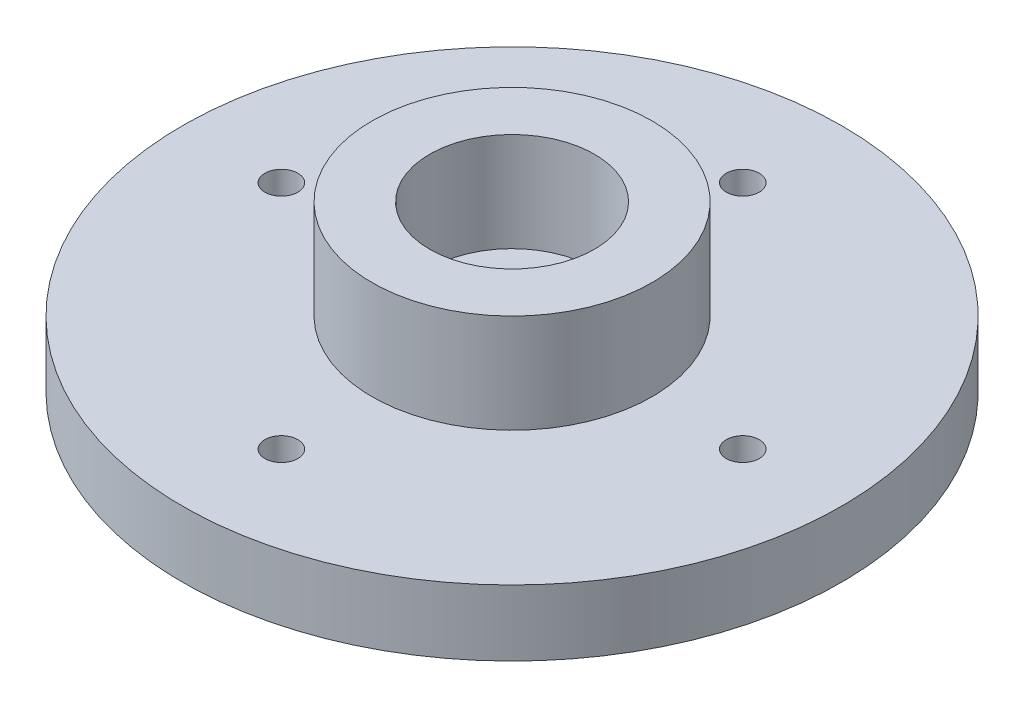
ISO-10303-21;
HEADER;
FILE_DESCRIPTION(('STEP AP214'),'2;1');
FILE_NAME('part.step','',(''),(''),'','','');
FILE_SCHEMA(('AUTOMOTIVE_DESIGN { 1 0 10303 214 1 1 1 1 }'));
ENDSEC;
DATA;
#1=APPLICATION_CONTEXT('core data for automotive mechanical design processes');
#2=APPLICATION_PROTOCOL_DEFINITION('international standard','automotive_design',2000,#1);
#3=PRODUCT_CONTEXT('',#1,'mechanical');
#4=PRODUCT('Part','Part','',(#3));
#5=PRODUCT_RELATED_PRODUCT_CATEGORY('part','',(#4));
#6=PRODUCT_DEFINITION_FORMATION('','',#4);
#7=PRODUCT_DEFINITION_CONTEXT('part definition',#1,'design');
#8=PRODUCT_DEFINITION('design','',#6,#7);
#9=PRODUCT_DEFINITION_SHAPE('','',#8);
#10=(LENGTH_UNIT() NAMED_UNIT(*) SI_UNIT(.MILLI.,.METRE.));
#11=(NAMED_UNIT(*) PLANE_ANGLE_UNIT() SI_UNIT($,.RADIAN.));
#12=(NAMED_UNIT(*) SI_UNIT($,.STERADIAN.) SOLID_ANGLE_UNIT());
#13=UNCERTAINTY_MEASURE_WITH_UNIT(LENGTH_MEASURE(1.E-05),#10,'distance_accuracy_value','');
#14=(GEOMETRIC_REPRESENTATION_CONTEXT(3) GLOBAL_UNCERTAINTY_ASSIGNED_CONTEXT((#13)) GLOBAL_UNIT_ASSIGNED_CONTEXT((#10,
#11,#12)) REPRESENTATION_CONTEXT('',''));
#15=CARTESIAN_POINT('',(0.,0.,0.));
#16=DIRECTION('',(0.,0.,1.));
#17=DIRECTION('',(1.,0.,0.));
#18=AXIS2_PLACEMENT_3D('',#15,#16,#17);
#19=CARTESIAN_POINT('',(0.,2.,0.));
#20=DIRECTION('',(0.,1.,0.));
#21=DIRECTION('',(0.,0.,1.));
#22=AXIS2_PLACEMENT_3D('',#19,#20,#21);
#23=PLANE('',#22);
#24=CARTESIAN_POINT('',(0.,2.,0.));
#25=DIRECTION('',(0.,1.,0.));
#26=DIRECTION('',(0.,0.,1.));
#27=AXIS2_PLACEMENT_3D('',#24,#25,#26);
#28=CIRCLE('',#27,2.5);
#29=CARTESIAN_POINT('',(0.,2.,2.5));
#30=VERTEX_POINT('',#29);
#31=EDGE_CURVE('E25',#30,#30,#28,.T.);
#32=ORIENTED_EDGE('',*,*,#31,.T.);
#33=EDGE_LOOP('',(#32));
#34=FACE_BOUND('',#33,.T.);
#35=CARTESIAN_POINT('',(0.,2.,0.));
#36=DIRECTION('',(0.,1.,0.));
#37=DIRECTION('',(0.,0.,1.));
#38=AXIS2_PLACEMENT_3D('',#35,#36,#37);
#39=CIRCLE('',#38,1.25);
#40=CARTESIAN_POINT('',(0.,2.,1.25));
#41=VERTEX_POINT('',#40);
#42=EDGE_CURVE('E83',#41,#41,#39,.F.);
#43=ORIENTED_EDGE('',*,*,#42,.T.);
#44=EDGE_LOOP('',(#43));
#45=FACE_BOUND('',#44,.T.);
#46=ADVANCED_FACE('F22',(#34,#45),#23,.T.);
#47=CARTESIAN_POINT('',(0.,2.,0.));
#48=DIRECTION('',(0.,1.,0.));
#49=DIRECTION('',(0.,0.,1.));
#50=AXIS2_PLACEMENT_3D('',#47,#48,#49);
#51=CYLINDRICAL_SURFACE('',#50,2.5);
#52=CARTESIAN_POINT('',(0.,5.,0.));
#53=DIRECTION('',(0.,1.,0.));
#54=DIRECTION('',(0.,0.,1.));
#55=AXIS2_PLACEMENT_3D('',#52,#53,#54);
#56=CIRCLE('',#55,2.5);
#57=CARTESIAN_POINT('',(0.,5.,2.5));
#58=VERTEX_POINT('',#57);
#59=EDGE_CURVE('E81',#58,#58,#56,.F.);
#60=ORIENTED_EDGE('',*,*,#59,.F.);
#61=EDGE_LOOP('',(#60));
#62=FACE_BOUND('',#61,.T.);
#63=ORIENTED_EDGE('',*,*,#31,.F.);
#64=EDGE_LOOP('',(#63));
#65=FACE_BOUND('',#64,.T.);
#66=ADVANCED_FACE('F91',(#62,#65),#51,.F.);
#67=CARTESIAN_POINT('',(0.,-1.,0.));
#68=DIRECTION('',(0.,1.,0.));
#69=DIRECTION('',(0.,0.,1.));
#70=AXIS2_PLACEMENT_3D('',#67,#68,#69);
#71=CYLINDRICAL_SURFACE('',#70,1.25);
#72=CARTESIAN_POINT('',(0.,0.,0.));
#73=DIRECTION('',(0.,1.,0.));
#74=DIRECTION('',(0.,0.,1.));
#75=AXIS2_PLACEMENT_3D('',#72,#73,#74);
#76=CIRCLE('',#75,1.25);
#77=CARTESIAN_POINT('',(0.,0.,1.25));
#78=VERTEX_POINT('',#77);
#79=EDGE_CURVE('E78',#78,#78,#76,.F.);
#80=ORIENTED_EDGE('',*,*,#79,.T.);
#81=EDGE_LOOP('',(#80));
#82=FACE_BOUND('',#81,.T.);
#83=ORIENTED_EDGE('',*,*,#42,.F.);
#84=EDGE_LOOP('',(#83));
#85=FACE_BOUND('',#84,.T.);
#86=ADVANCED_FACE('F93',(#82,#85),#71,.F.);
#87=CARTESIAN_POINT('',(0.,5.,0.));
#88=DIRECTION('',(0.,1.,0.));
#89=DIRECTION('',(0.,0.,1.));
#90=AXIS2_PLACEMENT_3D('',#87,#88,#89);
#91=PLANE('',#90);
#92=CARTESIAN_POINT('',(0.,5.,0.));
#93=DIRECTION('',(0.,-1.,0.));
#94=DIRECTION('',(0.,0.,-1.));
#95=AXIS2_PLACEMENT_3D('',#92,#93,#94);
#96=CIRCLE('',#95,4.25);
#97=CARTESIAN_POINT('',(0.,5.,-4.25));
#98=VERTEX_POINT('',#97);
#99=EDGE_CURVE('E75',#98,#98,#96,.T.);
#100=ORIENTED_EDGE('',*,*,#99,.F.);
#101=EDGE_LOOP('',(#100));
#102=FACE_BOUND('',#101,.T.);
#103=ORIENTED_EDGE('',*,*,#59,.T.);
#104=EDGE_LOOP('',(#103));
#105=FACE_BOUND('',#104,.T.);
#106=ADVANCED_FACE('F100',(#102,#105),#91,.T.);
#107=CARTESIAN_POINT('',(0.,0.,0.));
#108=DIRECTION('',(0.,1.,0.));
#109=DIRECTION('',(0.,0.,1.));
#110=AXIS2_PLACEMENT_3D('',#107,#108,#109);
#111=PLANE('',#110);
#112=ORIENTED_EDGE('',*,*,#79,.F.);
#113=EDGE_LOOP('',(#112));
#114=FACE_BOUND('',#113,.T.);
#115=CARTESIAN_POINT('',(0.,0.,0.));
#116=DIRECTION('',(0.,1.,0.));
#117=DIRECTION('',(0.,0.,1.));
#118=AXIS2_PLACEMENT_3D('',#115,#116,#117);
#119=CIRCLE('',#118,3.05);
#120=CARTESIAN_POINT('',(0.,0.,3.05));
#121=VERTEX_POINT('',#120);
#122=EDGE_CURVE('E72',#121,#121,#119,.F.);
#123=ORIENTED_EDGE('',*,*,#122,.T.);
#124=EDGE_LOOP('',(#123));
#125=FACE_BOUND('',#124,.T.);
#126=ADVANCED_FACE('F151',(#114,#125),#111,.F.);
#127=CARTESIAN_POINT('',(0.,5.,0.));
#128=DIRECTION('',(0.,-1.,0.));
#129=DIRECTION('',(0.,0.,-1.));
#130=AXIS2_PLACEMENT_3D('',#127,#128,#129);
#131=CYLINDRICAL_SURFACE('',#130,4.25);
#132=CARTESIAN_POINT('',(0.,2.,0.));
#133=DIRECTION('',(0.,-1.,0.));
#134=DIRECTION('',(0.,0.,-1.));
#135=AXIS2_PLACEMENT_3D('',#132,#133,#134);
#136=CIRCLE('',#135,4.25);
#137=CARTESIAN_POINT('',(0.,2.,-4.25));
#138=VERTEX_POINT('',#137);
#139=EDGE_CURVE('E69',#138,#138,#136,.T.);
#140=ORIENTED_EDGE('',*,*,#139,.F.);
#141=EDGE_LOOP('',(#140));
#142=FACE_BOUND('',#141,.T.);
#143=ORIENTED_EDGE('',*,*,#99,.T.);
#144=EDGE_LOOP('',(#143));
#145=FACE_BOUND('',#144,.T.);
#146=ADVANCED_FACE('F147',(#142,#145),#131,.T.);
#147=CARTESIAN_POINT('',(0.,-0.5,0.));
#148=DIRECTION('',(0.,1.,0.));
#149=DIRECTION('',(0.,0.,1.));
#150=AXIS2_PLACEMENT_3D('',#147,#148,#149);
#151=CYLINDRICAL_SURFACE('',#150,3.05);
#152=CARTESIAN_POINT('',(0.,-0.5,0.));
#153=DIRECTION('',(0.,1.,0.));
#154=DIRECTION('',(0.,0.,1.));
#155=AXIS2_PLACEMENT_3D('',#152,#153,#154);
#156=CIRCLE('',#155,3.05);
#157=CARTESIAN_POINT('',(0.,-0.5,3.05));
#158=VERTEX_POINT('',#157);
#159=EDGE_CURVE('E66',#158,#158,#156,.T.);
#160=ORIENTED_EDGE('',*,*,#159,.F.);
#161=EDGE_LOOP('',(#160));
#162=FACE_BOUND('',#161,.T.);
#163=ORIENTED_EDGE('',*,*,#122,.F.);
#164=EDGE_LOOP('',(#163));
#165=FACE_BOUND('',#164,.T.);
#166=ADVANCED_FACE('F143',(#162,#165),#151,.F.);
#167=CARTESIAN_POINT('',(0.,2.,0.));
#168=DIRECTION('',(0.,1.,0.));
#169=DIRECTION('',(0.,0.,1.));
#170=AXIS2_PLACEMENT_3D('',#167,#168,#169);
#171=PLANE('',#170);
#172=ORIENTED_EDGE('',*,*,#139,.T.);
#173=EDGE_LOOP('',(#172));
#174=FACE_BOUND('',#173,.T.);
#175=CARTESIAN_POINT('',(0.,2.,0.));
#176=DIRECTION('',(0.,-1.,0.));
#177=DIRECTION('',(0.,0.,-1.));
#178=AXIS2_PLACEMENT_3D('',#175,#176,#177);
#179=CIRCLE('',#178,10.);
#180=CARTESIAN_POINT('',(0.,2.,-10.));
#181=VERTEX_POINT('',#180);
#182=EDGE_CURVE('E51',#181,#181,#179,.T.);
#183=ORIENTED_EDGE('',*,*,#182,.F.);
#184=EDGE_LOOP('',(#183));
#185=FACE_BOUND('',#184,.T.);
#186=CARTESIAN_POINT('',(0.,2.,7.));
#187=DIRECTION('',(0.,-1.,0.));
#188=DIRECTION('',(0.,0.,-1.));
#189=AXIS2_PLACEMENT_3D('',#186,#187,#188);
#190=CIRCLE('',#189,0.5);
#191=CARTESIAN_POINT('',(0.,2.,6.5));
#192=VERTEX_POINT('',#191);
#193=EDGE_CURVE('E54',#192,#192,#190,.T.);
#194=ORIENTED_EDGE('',*,*,#193,.T.);
#195=EDGE_LOOP('',(#194));
#196=FACE_BOUND('',#195,.T.);
#197=CARTESIAN_POINT('',(7.,2.,0.));
#198=DIRECTION('',(0.,-1.,0.));
#199=DIRECTION('',(0.,0.,-1.));
#200=AXIS2_PLACEMENT_3D('',#197,#198,#199);
#201=CIRCLE('',#200,0.5);
#202=CARTESIAN_POINT('',(7.,2.,-0.5));
#203=VERTEX_POINT('',#202);
#204=EDGE_CURVE('E57',#203,#203,#201,.T.);
#205=ORIENTED_EDGE('',*,*,#204,.T.);
#206=EDGE_LOOP('',(#205));
#207=FACE_BOUND('',#206,.T.);
#208=CARTESIAN_POINT('',(0.,2.,-7.));
#209=DIRECTION('',(0.,-1.,0.));
#210=DIRECTION('',(0.,0.,-1.));
#211=AXIS2_PLACEMENT_3D('',#208,#209,#210);
#212=CIRCLE('',#211,0.5);
#213=CARTESIAN_POINT('',(0.,2.,-7.5));
#214=VERTEX_POINT('',#213);
#215=EDGE_CURVE('E60',#214,#214,#212,.T.);
#216=ORIENTED_EDGE('',*,*,#215,.T.);
#217=EDGE_LOOP('',(#216));
#218=FACE_BOUND('',#217,.T.);
#219=CARTESIAN_POINT('',(-7.,2.,0.));
#220=DIRECTION('',(0.,-1.,0.));
#221=DIRECTION('',(0.,0.,-1.));
#222=AXIS2_PLACEMENT_3D('',#219,#220,#221);
#223=CIRCLE('',#222,0.5);
#224=CARTESIAN_POINT('',(-7.,2.,-0.5));
#225=VERTEX_POINT('',#224);
#226=EDGE_CURVE('E63',#225,#225,#223,.T.);
#227=ORIENTED_EDGE('',*,*,#226,.T.);
#228=EDGE_LOOP('',(#227));
#229=FACE_BOUND('',#228,.T.);
#230=ADVANCED_FACE('F139',(#174,#185,#196,#207,#218,#229),#171,.T.);
#231=CARTESIAN_POINT('',(0.,-0.5,0.));
#232=DIRECTION('',(0.,-1.,0.));
#233=DIRECTION('',(0.,0.,-1.));
#234=AXIS2_PLACEMENT_3D('',#231,#232,#233);
#235=PLANE('',#234);
#236=ORIENTED_EDGE('',*,*,#159,.T.);
#237=EDGE_LOOP('',(#236));
#238=FACE_BOUND('',#237,.T.);
#239=CARTESIAN_POINT('',(0.,-0.5,0.));
#240=DIRECTION('',(0.,1.,0.));
#241=DIRECTION('',(0.,0.,1.));
#242=AXIS2_PLACEMENT_3D('',#239,#240,#241);
#243=CIRCLE('',#242,3.25);
#244=CARTESIAN_POINT('',(0.,-0.5,3.25));
#245=VERTEX_POINT('',#244);
#246=EDGE_CURVE('E48',#245,#245,#243,.T.);
#247=ORIENTED_EDGE('',*,*,#246,.F.);
#248=EDGE_LOOP('',(#247));
#249=FACE_BOUND('',#248,.T.);
#250=ADVANCED_FACE('F135',(#238,#249),#235,.T.);
#251=CARTESIAN_POINT('',(-7.,10.,0.));
#252=DIRECTION('',(0.,-1.,0.));
#253=DIRECTION('',(0.,0.,-1.));
#254=AXIS2_PLACEMENT_3D('',#251,#252,#253);
#255=CYLINDRICAL_SURFACE('',#254,0.5);
#256=ORIENTED_EDGE('',*,*,#226,.F.);
#257=EDGE_LOOP('',(#256));
#258=FACE_BOUND('',#257,.T.);
#259=CARTESIAN_POINT('',(-7.,0.,0.));
#260=DIRECTION('',(0.,-1.,0.));
#261=DIRECTION('',(0.,0.,-1.));
#262=AXIS2_PLACEMENT_3D('',#259,#260,#261);
#263=CIRCLE('',#262,0.5);
#264=CARTESIAN_POINT('',(-7.,0.,-0.5));
#265=VERTEX_POINT('',#264);
#266=EDGE_CURVE('E45',#265,#265,#263,.T.);
#267=ORIENTED_EDGE('',*,*,#266,.T.);
#268=EDGE_LOOP('',(#267));
#269=FACE_BOUND('',#268,.T.);
#270=ADVANCED_FACE('F131',(#258,#269),#255,.F.);
#271=CARTESIAN_POINT('',(0.,10.,-7.));
#272=DIRECTION('',(0.,-1.,0.));
#273=DIRECTION('',(0.,0.,-1.));
#274=AXIS2_PLACEMENT_3D('',#271,#272,#273);
#275=CYLINDRICAL_SURFACE('',#274,0.5);
#276=ORIENTED_EDGE('',*,*,#215,.F.);
#277=EDGE_LOOP('',(#276));
#278=FACE_BOUND('',#277,.T.);
#279=CARTESIAN_POINT('',(0.,0.,-7.));
#280=DIRECTION('',(0.,-1.,0.));
#281=DIRECTION('',(0.,0.,-1.));
#282=AXIS2_PLACEMENT_3D('',#279,#280,#281);
#283=CIRCLE('',#282,0.5);
#284=CARTESIAN_POINT('',(0.,0.,-7.5));
#285=VERTEX_POINT('',#284);
#286=EDGE_CURVE('E42',#285,#285,#283,.T.);
#287=ORIENTED_EDGE('',*,*,#286,.T.);
#288=EDGE_LOOP('',(#287));
#289=FACE_BOUND('',#288,.T.);
#290=ADVANCED_FACE('F127',(#278,#289),#275,.F.);
#291=CARTESIAN_POINT('',(7.,10.,0.));
#292=DIRECTION('',(0.,-1.,0.));
#293=DIRECTION('',(0.,0.,-1.));
#294=AXIS2_PLACEMENT_3D('',#291,#292,#293);
#295=CYLINDRICAL_SURFACE('',#294,0.5);
#296=ORIENTED_EDGE('',*,*,#204,.F.);
#297=EDGE_LOOP('',(#296));
#298=FACE_BOUND('',#297,.T.);
#299=CARTESIAN_POINT('',(7.,0.,0.));
#300=DIRECTION('',(0.,-1.,0.));
#301=DIRECTION('',(0.,0.,-1.));
#302=AXIS2_PLACEMENT_3D('',#299,#300,#301);
#303=CIRCLE('',#302,0.5);
#304=CARTESIAN_POINT('',(7.,0.,-0.5));
#305=VERTEX_POINT('',#304);
#306=EDGE_CURVE('E39',#305,#305,#303,.T.);
#307=ORIENTED_EDGE('',*,*,#306,.T.);
#308=EDGE_LOOP('',(#307));
#309=FACE_BOUND('',#308,.T.);
#310=ADVANCED_FACE('F123',(#298,#309),#295,.F.);
#311=CARTESIAN_POINT('',(0.,10.,7.));
#312=DIRECTION('',(0.,-1.,0.));
#313=DIRECTION('',(0.,0.,-1.));
#314=AXIS2_PLACEMENT_3D('',#311,#312,#313);
#315=CYLINDRICAL_SURFACE('',#314,0.5);
#316=ORIENTED_EDGE('',*,*,#193,.F.);
#317=EDGE_LOOP('',(#316));
#318=FACE_BOUND('',#317,.T.);
#319=CARTESIAN_POINT('',(0.,0.,7.));
#320=DIRECTION('',(0.,-1.,0.));
#321=DIRECTION('',(0.,0.,-1.));
#322=AXIS2_PLACEMENT_3D('',#319,#320,#321);
#323=CIRCLE('',#322,0.5);
#324=CARTESIAN_POINT('',(0.,0.,6.5));
#325=VERTEX_POINT('',#324);
#326=EDGE_CURVE('E34',#325,#325,#323,.T.);
#327=ORIENTED_EDGE('',*,*,#326,.T.);
#328=EDGE_LOOP('',(#327));
#329=FACE_BOUND('',#328,.T.);
#330=ADVANCED_FACE('F119',(#318,#329),#315,.F.);
#331=CARTESIAN_POINT('',(0.,2.,0.));
#332=DIRECTION('',(0.,-1.,0.));
#333=DIRECTION('',(0.,0.,-1.));
#334=AXIS2_PLACEMENT_3D('',#331,#332,#333);
#335=CYLINDRICAL_SURFACE('',#334,10.);
#336=ORIENTED_EDGE('',*,*,#182,.T.);
#337=EDGE_LOOP('',(#336));
#338=FACE_BOUND('',#337,.T.);
#339=CARTESIAN_POINT('',(0.,0.,0.));
#340=DIRECTION('',(0.,-1.,0.));
#341=DIRECTION('',(0.,0.,-1.));
#342=AXIS2_PLACEMENT_3D('',#339,#340,#341);
#343=CIRCLE('',#342,10.);
#344=CARTESIAN_POINT('',(0.,0.,-10.));
#345=VERTEX_POINT('',#344);
#346=EDGE_CURVE('E29',#345,#345,#343,.F.);
#347=ORIENTED_EDGE('',*,*,#346,.T.);
#348=EDGE_LOOP('',(#347));
#349=FACE_BOUND('',#348,.T.);
#350=ADVANCED_FACE('F112',(#338,#349),#335,.T.);
#351=CARTESIAN_POINT('',(0.,-0.5,0.));
#352=DIRECTION('',(0.,1.,0.));
#353=DIRECTION('',(0.,0.,1.));
#354=AXIS2_PLACEMENT_3D('',#351,#352,#353);
#355=CYLINDRICAL_SURFACE('',#354,3.25);
#356=ORIENTED_EDGE('',*,*,#246,.T.);
#357=EDGE_LOOP('',(#356));
#358=FACE_BOUND('',#357,.T.);
#359=CARTESIAN_POINT('',(0.,0.,0.));
#360=DIRECTION('',(0.,1.,0.));
#361=DIRECTION('',(0.,0.,1.));
#362=AXIS2_PLACEMENT_3D('',#359,#360,#361);
#363=CIRCLE('',#362,3.25);
#364=CARTESIAN_POINT('',(0.,0.,3.25));
#365=VERTEX_POINT('',#364);
#366=EDGE_CURVE('E12',#365,#365,#363,.F.);
#367=ORIENTED_EDGE('',*,*,#366,.T.);
#368=EDGE_LOOP('',(#367));
#369=FACE_BOUND('',#368,.T.);
#370=ADVANCED_FACE('F106',(#358,#369),#355,.T.);
#371=CARTESIAN_POINT('',(0.,0.,0.));
#372=DIRECTION('',(0.,1.,0.));
#373=DIRECTION('',(0.,0.,1.));
#374=AXIS2_PLACEMENT_3D('',#371,#372,#373);
#375=PLANE('',#374);
#376=ORIENTED_EDGE('',*,*,#366,.F.);
#377=EDGE_LOOP('',(#376));
#378=FACE_BOUND('',#377,.T.);
#379=ORIENTED_EDGE('',*,*,#346,.F.);
#380=EDGE_LOOP('',(#379));
#381=FACE_BOUND('',#380,.T.);
#382=ORIENTED_EDGE('',*,*,#326,.F.);
#383=EDGE_LOOP('',(#382));
#384=FACE_BOUND('',#383,.T.);
#385=ORIENTED_EDGE('',*,*,#306,.F.);
#386=EDGE_LOOP('',(#385));
#387=FACE_BOUND('',#386,.T.);
#388=ORIENTED_EDGE('',*,*,#286,.F.);
#389=EDGE_LOOP('',(#388));
#390=FACE_BOUND('',#389,.T.);
#391=ORIENTED_EDGE('',*,*,#266,.F.);
#392=EDGE_LOOP('',(#391));
#393=FACE_BOUND('',#392,.T.);
#394=ADVANCED_FACE('F104',(#378,#381,#384,#387,#390,#393),#375,.F.);
#395=CLOSED_SHELL('',(#46,#66,#86,#106,#126,#146,#166,#230,#250,#270,#290,#310,#330,#350,#370,#394));
#396=MANIFOLD_SOLID_BREP('B1',#395);
#397=ADVANCED_BREP_SHAPE_REPRESENTATION('',(#18,#396),#14);
#398=SHAPE_DEFINITION_REPRESENTATION(#9,#397);
ENDSEC;
END-ISO-10303-21;
